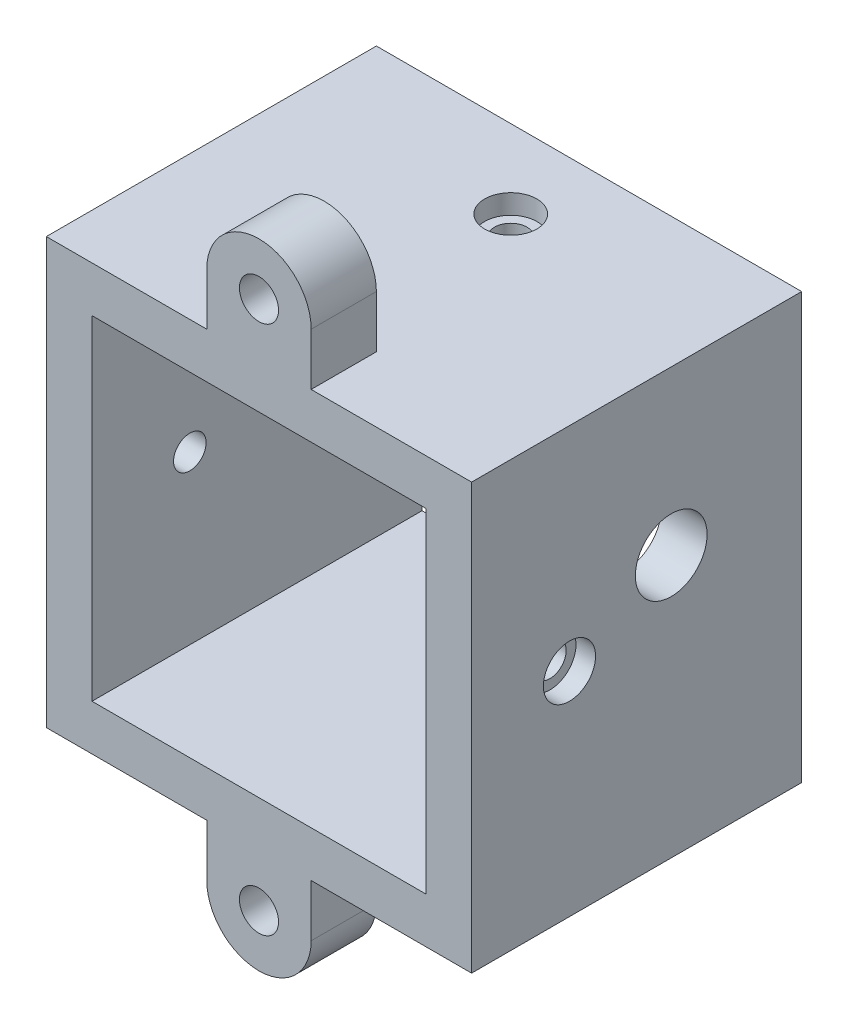
ISO-10303-21;
HEADER;
FILE_DESCRIPTION(('STEP AP214'),'2;1');
FILE_NAME('part.step','',(''),(''),'','','');
FILE_SCHEMA(('AUTOMOTIVE_DESIGN { 1 0 10303 214 1 1 1 1 }'));
ENDSEC;
DATA;
#1=APPLICATION_CONTEXT('core data for automotive mechanical design processes');
#2=APPLICATION_PROTOCOL_DEFINITION('international standard','automotive_design',2000,#1);
#3=PRODUCT_CONTEXT('',#1,'mechanical');
#4=PRODUCT('Part','Part','',(#3));
#5=PRODUCT_RELATED_PRODUCT_CATEGORY('part','',(#4));
#6=PRODUCT_DEFINITION_FORMATION('','',#4);
#7=PRODUCT_DEFINITION_CONTEXT('part definition',#1,'design');
#8=PRODUCT_DEFINITION('design','',#6,#7);
#9=PRODUCT_DEFINITION_SHAPE('','',#8);
#10=(LENGTH_UNIT() NAMED_UNIT(*) SI_UNIT(.MILLI.,.METRE.));
#11=(NAMED_UNIT(*) PLANE_ANGLE_UNIT() SI_UNIT($,.RADIAN.));
#12=(NAMED_UNIT(*) SI_UNIT($,.STERADIAN.) SOLID_ANGLE_UNIT());
#13=UNCERTAINTY_MEASURE_WITH_UNIT(LENGTH_MEASURE(1.E-05),#10,'distance_accuracy_value','');
#14=(GEOMETRIC_REPRESENTATION_CONTEXT(3) GLOBAL_UNCERTAINTY_ASSIGNED_CONTEXT((#13)) GLOBAL_UNIT_ASSIGNED_CONTEXT((#10,
#11,#12)) REPRESENTATION_CONTEXT('',''));
#15=CARTESIAN_POINT('',(0.,0.,0.));
#16=DIRECTION('',(0.,0.,1.));
#17=DIRECTION('',(1.,0.,0.));
#18=AXIS2_PLACEMENT_3D('',#15,#16,#17);
#19=CARTESIAN_POINT('',(0.,18.5289321881345,-38.6));
#20=DIRECTION('',(0.,1.,0.));
#21=DIRECTION('',(0.,0.,1.));
#22=AXIS2_PLACEMENT_3D('',#19,#20,#21);
#23=CYLINDRICAL_SURFACE('',#22,2.5);
#24=CARTESIAN_POINT('',(0.,25.6,-38.6));
#25=DIRECTION('',(0.,-1.,0.));
#26=DIRECTION('',(0.,0.,-1.));
#27=AXIS2_PLACEMENT_3D('',#24,#25,#26);
#28=CIRCLE('',#27,2.5);
#29=CARTESIAN_POINT('',(0.,25.6,-36.1));
#30=VERTEX_POINT('',#29);
#31=EDGE_CURVE('E337',#30,#30,#28,.F.);
#32=CARTESIAN_POINT('',(0.,29.6,-38.6));
#33=DIRECTION('',(0.,1.,0.));
#34=DIRECTION('',(0.,0.,1.));
#35=AXIS2_PLACEMENT_3D('',#32,#33,#34);
#36=CIRCLE('',#35,2.5);
#37=CARTESIAN_POINT('',(0.,29.6,-36.1));
#38=VERTEX_POINT('',#37);
#39=EDGE_CURVE('E62',#38,#38,#36,.F.);
#40=CARTESIAN_POINT('',(0.,25.6,-36.1));
#41=CARTESIAN_POINT('',(0.,25.6416666666667,-36.1));
#42=CARTESIAN_POINT('',(0.,25.6833333333333,-36.1));
#43=CARTESIAN_POINT('',(0.,25.7666666666667,-36.1));
#44=CARTESIAN_POINT('',(0.,25.8083333333333,-36.1));
#45=CARTESIAN_POINT('',(0.,25.8916666666667,-36.1));
#46=CARTESIAN_POINT('',(0.,25.9333333333333,-36.1));
#47=CARTESIAN_POINT('',(0.,26.0166666666667,-36.1));
#48=CARTESIAN_POINT('',(0.,26.0583333333333,-36.1));
#49=CARTESIAN_POINT('',(0.,26.1416666666667,-36.1));
#50=CARTESIAN_POINT('',(0.,26.1833333333333,-36.1));
#51=CARTESIAN_POINT('',(0.,26.2666666666667,-36.1));
#52=CARTESIAN_POINT('',(0.,26.3083333333333,-36.1));
#53=CARTESIAN_POINT('',(0.,26.3916666666667,-36.1));
#54=CARTESIAN_POINT('',(0.,26.4333333333333,-36.1));
#55=CARTESIAN_POINT('',(0.,26.5166666666667,-36.1));
#56=CARTESIAN_POINT('',(0.,26.5583333333333,-36.1));
#57=CARTESIAN_POINT('',(0.,26.6416666666667,-36.1));
#58=CARTESIAN_POINT('',(0.,26.6833333333333,-36.1));
#59=CARTESIAN_POINT('',(0.,26.7666666666667,-36.1));
#60=CARTESIAN_POINT('',(0.,26.8083333333333,-36.1));
#61=CARTESIAN_POINT('',(0.,26.8916666666667,-36.1));
#62=CARTESIAN_POINT('',(0.,26.9333333333333,-36.1));
#63=CARTESIAN_POINT('',(0.,27.0166666666667,-36.1));
#64=CARTESIAN_POINT('',(0.,27.0583333333333,-36.1));
#65=CARTESIAN_POINT('',(0.,27.1416666666667,-36.1));
#66=CARTESIAN_POINT('',(0.,27.1833333333333,-36.1));
#67=CARTESIAN_POINT('',(0.,27.2666666666667,-36.1));
#68=CARTESIAN_POINT('',(0.,27.3083333333333,-36.1));
#69=CARTESIAN_POINT('',(0.,27.3916666666667,-36.1));
#70=CARTESIAN_POINT('',(0.,27.4333333333333,-36.1));
#71=CARTESIAN_POINT('',(0.,27.5166666666667,-36.1));
#72=CARTESIAN_POINT('',(0.,27.5583333333333,-36.1));
#73=CARTESIAN_POINT('',(0.,27.6416666666667,-36.1));
#74=CARTESIAN_POINT('',(0.,27.6833333333333,-36.1));
#75=CARTESIAN_POINT('',(0.,27.7666666666667,-36.1));
#76=CARTESIAN_POINT('',(0.,27.8083333333333,-36.1));
#77=CARTESIAN_POINT('',(0.,27.8916666666667,-36.1));
#78=CARTESIAN_POINT('',(0.,27.9333333333333,-36.1));
#79=CARTESIAN_POINT('',(0.,28.0166666666667,-36.1));
#80=CARTESIAN_POINT('',(0.,28.0583333333333,-36.1));
#81=CARTESIAN_POINT('',(0.,28.1416666666667,-36.1));
#82=CARTESIAN_POINT('',(0.,28.1833333333333,-36.1));
#83=CARTESIAN_POINT('',(0.,28.2666666666667,-36.1));
#84=CARTESIAN_POINT('',(0.,28.3083333333333,-36.1));
#85=CARTESIAN_POINT('',(0.,28.3916666666667,-36.1));
#86=CARTESIAN_POINT('',(0.,28.4333333333333,-36.1));
#87=CARTESIAN_POINT('',(0.,28.5166666666667,-36.1));
#88=CARTESIAN_POINT('',(0.,28.5583333333333,-36.1));
#89=CARTESIAN_POINT('',(0.,28.6416666666667,-36.1));
#90=CARTESIAN_POINT('',(0.,28.6833333333333,-36.1));
#91=CARTESIAN_POINT('',(0.,28.7666666666667,-36.1));
#92=CARTESIAN_POINT('',(0.,28.8083333333333,-36.1));
#93=CARTESIAN_POINT('',(0.,28.8916666666667,-36.1));
#94=CARTESIAN_POINT('',(0.,28.9333333333333,-36.1));
#95=CARTESIAN_POINT('',(0.,29.0166666666667,-36.1));
#96=CARTESIAN_POINT('',(0.,29.0583333333333,-36.1));
#97=CARTESIAN_POINT('',(0.,29.1416666666667,-36.1));
#98=CARTESIAN_POINT('',(0.,29.1833333333333,-36.1));
#99=CARTESIAN_POINT('',(0.,29.2666666666667,-36.1));
#100=CARTESIAN_POINT('',(0.,29.3083333333333,-36.1));
#101=CARTESIAN_POINT('',(0.,29.3916666666667,-36.1));
#102=CARTESIAN_POINT('',(0.,29.4333333333333,-36.1));
#103=CARTESIAN_POINT('',(0.,29.5166666666667,-36.1));
#104=CARTESIAN_POINT('',(0.,29.5583333333333,-36.1));
#105=CARTESIAN_POINT('',(0.,29.6,-36.1));
#106=B_SPLINE_CURVE_WITH_KNOTS('',3,(#40,#41,#42,#43,#44,#45,#46,#47,#48,#49,#50,#51,#52,#53,
#54,#55,#56,#57,#58,#59,#60,#61,#62,#63,#64,#65,#66,#67,#68,#69,#70,#71,#72,#73,#74,#75,#76,#77,
#78,#79,#80,#81,#82,#83,#84,#85,#86,#87,#88,#89,#90,#91,#92,#93,#94,#95,#96,#97,#98,#99,#100,
#101,#102,#103,#104,#105),.UNSPECIFIED.,.F.,.F.,(4,2,2,2,2,2,2,2,2,2,2,2,2,2,2,2,2,2,2,2,2,2,2,
2,2,2,2,2,2,2,2,2,4),(0.,0.125,0.25,0.375,0.5,0.625000000000001,0.750000000000001,
0.875000000000001,1.,1.125,1.25,1.375,1.5,1.625,1.75,1.875,2.,2.125,2.25,2.375,2.5,2.625,2.75,
2.875,3.,3.125,3.25,3.375,3.5,3.625,3.75,3.875,4.),.UNSPECIFIED.);
#107=EDGE_CURVE('BSEAM58',#30,#38,#106,.T.);
#108=ORIENTED_EDGE('',*,*,#31,.F.);
#109=ORIENTED_EDGE('',*,*,#39,.F.);
#110=ORIENTED_EDGE('',*,*,#107,.T.);
#111=ORIENTED_EDGE('',*,*,#107,.F.);
#112=EDGE_LOOP('',(#108,#110,#109,#111));
#113=FACE_BOUND('',#112,.T.);
#114=ADVANCED_FACE('F58',(#113),#23,.F.);
#115=CARTESIAN_POINT('',(-32.6,0.,-15.));
#116=DIRECTION('',(1.,0.,0.));
#117=DIRECTION('',(0.,0.,-1.));
#118=AXIS2_PLACEMENT_3D('',#115,#116,#117);
#119=CYLINDRICAL_SURFACE('',#118,2.5);
#120=CARTESIAN_POINT('',(-25.6,0.,-15.));
#121=DIRECTION('',(1.,0.,0.));
#122=DIRECTION('',(0.,0.,-1.));
#123=AXIS2_PLACEMENT_3D('',#120,#121,#122);
#124=CIRCLE('',#123,2.5);
#125=CARTESIAN_POINT('',(-25.6,0.,-17.5));
#126=VERTEX_POINT('',#125);
#127=EDGE_CURVE('E319',#126,#126,#124,.T.);
#128=ORIENTED_EDGE('',*,*,#127,.T.);
#129=EDGE_LOOP('',(#128));
#130=FACE_BOUND('',#129,.T.);
#131=CARTESIAN_POINT('',(-29.6,0.,-15.));
#132=DIRECTION('',(-1.,0.,0.));
#133=DIRECTION('',(0.,0.,1.));
#134=AXIS2_PLACEMENT_3D('',#131,#132,#133);
#135=CIRCLE('',#134,2.5);
#136=CARTESIAN_POINT('',(-29.6,0.,-12.5));
#137=VERTEX_POINT('',#136);
#138=EDGE_CURVE('E323',#137,#137,#135,.F.);
#139=ORIENTED_EDGE('',*,*,#138,.F.);
#140=EDGE_LOOP('',(#139));
#141=FACE_BOUND('',#140,.T.);
#142=ADVANCED_FACE('F388',(#130,#141),#119,.F.);
#143=CARTESIAN_POINT('',(25.6,0.,-15.));
#144=DIRECTION('',(1.,0.,0.));
#145=DIRECTION('',(0.,0.,-1.));
#146=AXIS2_PLACEMENT_3D('',#143,#144,#145);
#147=CIRCLE('',#146,2.5);
#148=CARTESIAN_POINT('',(25.6,0.,-17.5));
#149=VERTEX_POINT('',#148);
#150=EDGE_CURVE('E316',#149,#149,#147,.T.);
#151=ORIENTED_EDGE('',*,*,#150,.F.);
#152=EDGE_LOOP('',(#151));
#153=FACE_BOUND('',#152,.T.);
#154=CARTESIAN_POINT('',(29.6,0.,-15.));
#155=DIRECTION('',(1.,0.,0.));
#156=DIRECTION('',(0.,0.,-1.));
#157=AXIS2_PLACEMENT_3D('',#154,#155,#156);
#158=CIRCLE('',#157,2.5);
#159=CARTESIAN_POINT('',(29.6,0.,-17.5));
#160=VERTEX_POINT('',#159);
#161=EDGE_CURVE('E320',#160,#160,#158,.F.);
#162=ORIENTED_EDGE('',*,*,#161,.F.);
#163=EDGE_LOOP('',(#162));
#164=FACE_BOUND('',#163,.T.);
#165=ADVANCED_FACE('F394',(#153,#164),#119,.F.);
#166=CARTESIAN_POINT('',(0.,32.6,-50.6));
#167=DIRECTION('',(0.,-1.,0.));
#168=DIRECTION('',(0.,0.,-1.));
#169=AXIS2_PLACEMENT_3D('',#166,#167,#168);
#170=PLANE('',#169);
#171=CARTESIAN_POINT('',(0.,32.6,-38.6));
#172=DIRECTION('',(0.,1.,0.));
#173=DIRECTION('',(0.,0.,1.));
#174=AXIS2_PLACEMENT_3D('',#171,#172,#173);
#175=CIRCLE('',#174,4.);
#176=CARTESIAN_POINT('',(0.,32.6,-34.6));
#177=VERTEX_POINT('',#176);
#178=EDGE_CURVE('E517',#177,#177,#175,.T.);
#179=ORIENTED_EDGE('',*,*,#178,.F.);
#180=EDGE_LOOP('',(#179));
#181=FACE_BOUND('',#180,.T.);
#182=DIRECTION('',(0.,0.,1.));
#183=VECTOR('',#182,1.);
#184=CARTESIAN_POINT('',(-7.99999999999999,32.6,-10.));
#185=LINE('',#184,#183);
#186=CARTESIAN_POINT('',(-7.99999999999999,32.6,-10.));
#187=VERTEX_POINT('',#186);
#188=CARTESIAN_POINT('',(-7.99999999999999,32.6,0.));
#189=VERTEX_POINT('',#188);
#190=EDGE_CURVE('E248',#187,#189,#185,.T.);
#191=ORIENTED_EDGE('',*,*,#190,.F.);
#192=DIRECTION('',(1.,0.,0.));
#193=VECTOR('',#192,1.);
#194=CARTESIAN_POINT('',(0.,32.6,-10.));
#195=LINE('',#194,#193);
#196=CARTESIAN_POINT('',(8.,32.6,-10.));
#197=VERTEX_POINT('',#196);
#198=EDGE_CURVE('E233',#187,#197,#195,.T.);
#199=ORIENTED_EDGE('',*,*,#198,.T.);
#200=DIRECTION('',(0.,0.,1.));
#201=VECTOR('',#200,1.);
#202=CARTESIAN_POINT('',(8.,32.6,-10.));
#203=LINE('',#202,#201);
#204=CARTESIAN_POINT('',(8.,32.6,0.));
#205=VERTEX_POINT('',#204);
#206=EDGE_CURVE('E245',#197,#205,#203,.T.);
#207=ORIENTED_EDGE('',*,*,#206,.T.);
#208=DIRECTION('',(1.,0.,0.));
#209=VECTOR('',#208,1.);
#210=CARTESIAN_POINT('',(0.,32.6,0.));
#211=LINE('',#210,#209);
#212=CARTESIAN_POINT('',(32.6,32.6,0.));
#213=VERTEX_POINT('',#212);
#214=EDGE_CURVE('E307',#205,#213,#211,.T.);
#215=ORIENTED_EDGE('',*,*,#214,.T.);
#216=DIRECTION('',(0.,0.,1.));
#217=VECTOR('',#216,1.);
#218=CARTESIAN_POINT('',(32.6,32.6,-50.6));
#219=LINE('',#218,#217);
#220=CARTESIAN_POINT('',(32.6,32.6,-50.6));
#221=VERTEX_POINT('',#220);
#222=EDGE_CURVE('E67',#221,#213,#219,.T.);
#223=ORIENTED_EDGE('',*,*,#222,.F.);
#224=DIRECTION('',(1.,0.,0.));
#225=VECTOR('',#224,1.);
#226=CARTESIAN_POINT('',(0.,32.6,-50.6));
#227=LINE('',#226,#225);
#228=CARTESIAN_POINT('',(-32.6,32.6,-50.6));
#229=VERTEX_POINT('',#228);
#230=EDGE_CURVE('E295',#229,#221,#227,.T.);
#231=ORIENTED_EDGE('',*,*,#230,.F.);
#232=DIRECTION('',(0.,0.,1.));
#233=VECTOR('',#232,1.);
#234=CARTESIAN_POINT('',(-32.6,32.6,-50.6));
#235=LINE('',#234,#233);
#236=CARTESIAN_POINT('',(-32.6,32.6,0.));
#237=VERTEX_POINT('',#236);
#238=EDGE_CURVE('E12',#229,#237,#235,.T.);
#239=ORIENTED_EDGE('',*,*,#238,.T.);
#240=EDGE_CURVE('E289',#237,#189,#211,.T.);
#241=ORIENTED_EDGE('',*,*,#240,.T.);
#242=EDGE_LOOP('',(#191,#199,#207,#215,#223,#231,#239,#241));
#243=FACE_BOUND('',#242,.T.);
#244=ADVANCED_FACE('F464',(#181,#243),#170,.F.);
#245=CARTESIAN_POINT('',(0.,0.,-50.6));
#246=DIRECTION('',(0.,0.,1.));
#247=DIRECTION('',(1.,0.,0.));
#248=AXIS2_PLACEMENT_3D('',#245,#246,#247);
#249=PLANE('',#248);
#250=DIRECTION('',(0.,1.,0.));
#251=VECTOR('',#250,1.);
#252=CARTESIAN_POINT('',(-32.6,0.,-50.6));
#253=LINE('',#252,#251);
#254=CARTESIAN_POINT('',(-32.6,-32.6,-50.6));
#255=VERTEX_POINT('',#254);
#256=EDGE_CURVE('E285',#255,#229,#253,.T.);
#257=ORIENTED_EDGE('',*,*,#256,.T.);
#258=ORIENTED_EDGE('',*,*,#230,.T.);
#259=DIRECTION('',(0.,1.,0.));
#260=VECTOR('',#259,1.);
#261=CARTESIAN_POINT('',(32.6,0.,-50.6));
#262=LINE('',#261,#260);
#263=CARTESIAN_POINT('',(32.6,-32.6,-50.6));
#264=VERTEX_POINT('',#263);
#265=EDGE_CURVE('E292',#264,#221,#262,.T.);
#266=ORIENTED_EDGE('',*,*,#265,.F.);
#267=DIRECTION('',(1.,0.,0.));
#268=VECTOR('',#267,1.);
#269=CARTESIAN_POINT('',(0.,-32.6,-50.6));
#270=LINE('',#269,#268);
#271=EDGE_CURVE('E288',#255,#264,#270,.T.);
#272=ORIENTED_EDGE('',*,*,#271,.F.);
#273=EDGE_LOOP('',(#257,#258,#266,#272));
#274=FACE_BOUND('',#273,.T.);
#275=DIRECTION('',(0.,1.,0.));
#276=VECTOR('',#275,1.);
#277=CARTESIAN_POINT('',(-25.6,-25.6,-50.6));
#278=LINE('',#277,#276);
#279=CARTESIAN_POINT('',(-25.6,-25.6,-50.6));
#280=VERTEX_POINT('',#279);
#281=CARTESIAN_POINT('',(-25.6,25.6,-50.6));
#282=VERTEX_POINT('',#281);
#283=EDGE_CURVE('E253',#280,#282,#278,.T.);
#284=ORIENTED_EDGE('',*,*,#283,.F.);
#285=DIRECTION('',(1.,0.,0.));
#286=VECTOR('',#285,1.);
#287=CARTESIAN_POINT('',(-25.6,-25.6,-50.6));
#288=LINE('',#287,#286);
#289=CARTESIAN_POINT('',(25.6,-25.6,-50.6));
#290=VERTEX_POINT('',#289);
#291=EDGE_CURVE('E261',#280,#290,#288,.T.);
#292=ORIENTED_EDGE('',*,*,#291,.T.);
#293=DIRECTION('',(0.,1.,0.));
#294=VECTOR('',#293,1.);
#295=CARTESIAN_POINT('',(25.6,-25.6,-50.6));
#296=LINE('',#295,#294);
#297=CARTESIAN_POINT('',(25.6,25.6,-50.6));
#298=VERTEX_POINT('',#297);
#299=EDGE_CURVE('E258',#290,#298,#296,.T.);
#300=ORIENTED_EDGE('',*,*,#299,.T.);
#301=DIRECTION('',(1.,0.,0.));
#302=VECTOR('',#301,1.);
#303=CARTESIAN_POINT('',(-25.6,25.6,-50.6));
#304=LINE('',#303,#302);
#305=EDGE_CURVE('E255',#282,#298,#304,.T.);
#306=ORIENTED_EDGE('',*,*,#305,.F.);
#307=EDGE_LOOP('',(#284,#292,#300,#306));
#308=FACE_BOUND('',#307,.T.);
#309=ADVANCED_FACE('F376',(#274,#308),#249,.F.);
#310=CARTESIAN_POINT('',(0.,0.,0.));
#311=DIRECTION('',(0.,0.,1.));
#312=DIRECTION('',(1.,0.,0.));
#313=AXIS2_PLACEMENT_3D('',#310,#311,#312);
#314=PLANE('',#313);
#315=DIRECTION('',(0.,1.,0.));
#316=VECTOR('',#315,1.);
#317=CARTESIAN_POINT('',(-32.6,0.,0.));
#318=LINE('',#317,#316);
#319=CARTESIAN_POINT('',(-32.6,-32.6,0.));
#320=VERTEX_POINT('',#319);
#321=EDGE_CURVE('E284',#320,#237,#318,.T.);
#322=ORIENTED_EDGE('',*,*,#321,.F.);
#323=DIRECTION('',(1.,0.,0.));
#324=VECTOR('',#323,1.);
#325=CARTESIAN_POINT('',(0.,-32.6,0.));
#326=LINE('',#325,#324);
#327=CARTESIAN_POINT('',(-7.99999999999998,-32.6,0.));
#328=VERTEX_POINT('',#327);
#329=EDGE_CURVE('E301',#320,#328,#326,.T.);
#330=ORIENTED_EDGE('',*,*,#329,.T.);
#331=DIRECTION('',(0.,-1.,0.));
#332=VECTOR('',#331,1.);
#333=CARTESIAN_POINT('',(-7.99999999999992,0.,0.));
#334=LINE('',#333,#332);
#335=CARTESIAN_POINT('',(-7.99999999999999,-40.6,0.));
#336=VERTEX_POINT('',#335);
#337=EDGE_CURVE('E75',#328,#336,#334,.T.);
#338=ORIENTED_EDGE('',*,*,#337,.T.);
#339=CARTESIAN_POINT('',(0.,-40.6,0.));
#340=DIRECTION('',(0.,0.,1.));
#341=DIRECTION('',(1.,0.,0.));
#342=AXIS2_PLACEMENT_3D('',#339,#340,#341);
#343=CIRCLE('',#342,8.);
#344=CARTESIAN_POINT('',(8.00000000000001,-40.6,0.));
#345=VERTEX_POINT('',#344);
#346=EDGE_CURVE('E212',#345,#336,#343,.F.);
#347=ORIENTED_EDGE('',*,*,#346,.F.);
#348=DIRECTION('',(0.,-1.,0.));
#349=VECTOR('',#348,1.);
#350=CARTESIAN_POINT('',(7.99999999999994,0.,0.));
#351=LINE('',#350,#349);
#352=CARTESIAN_POINT('',(7.99999999999999,-32.6,0.));
#353=VERTEX_POINT('',#352);
#354=EDGE_CURVE('E189',#353,#345,#351,.T.);
#355=ORIENTED_EDGE('',*,*,#354,.F.);
#356=CARTESIAN_POINT('',(32.6,-32.6,0.));
#357=VERTEX_POINT('',#356);
#358=EDGE_CURVE('E300',#353,#357,#326,.T.);
#359=ORIENTED_EDGE('',*,*,#358,.T.);
#360=DIRECTION('',(0.,1.,0.));
#361=VECTOR('',#360,1.);
#362=CARTESIAN_POINT('',(32.6,0.,0.));
#363=LINE('',#362,#361);
#364=EDGE_CURVE('E304',#357,#213,#363,.T.);
#365=ORIENTED_EDGE('',*,*,#364,.T.);
#366=ORIENTED_EDGE('',*,*,#214,.F.);
#367=DIRECTION('',(0.,1.,0.));
#368=VECTOR('',#367,1.);
#369=CARTESIAN_POINT('',(7.99999999999994,0.,0.));
#370=LINE('',#369,#368);
#371=CARTESIAN_POINT('',(8.00000000000001,40.6,0.));
#372=VERTEX_POINT('',#371);
#373=EDGE_CURVE('E83',#205,#372,#370,.T.);
#374=ORIENTED_EDGE('',*,*,#373,.T.);
#375=CARTESIAN_POINT('',(0.,40.6,0.));
#376=DIRECTION('',(0.,0.,1.));
#377=DIRECTION('',(1.,0.,0.));
#378=AXIS2_PLACEMENT_3D('',#375,#376,#377);
#379=CIRCLE('',#378,8.);
#380=CARTESIAN_POINT('',(-7.99999999999999,40.6,0.));
#381=VERTEX_POINT('',#380);
#382=EDGE_CURVE('E240',#372,#381,#379,.T.);
#383=ORIENTED_EDGE('',*,*,#382,.T.);
#384=DIRECTION('',(0.,1.,0.));
#385=VECTOR('',#384,1.);
#386=CARTESIAN_POINT('',(-7.99999999999999,0.,0.));
#387=LINE('',#386,#385);
#388=EDGE_CURVE('E225',#189,#381,#387,.T.);
#389=ORIENTED_EDGE('',*,*,#388,.F.);
#390=ORIENTED_EDGE('',*,*,#240,.F.);
#391=EDGE_LOOP('',(#322,#330,#338,#347,#355,#359,#365,#366,#374,#383,#389,#390));
#392=FACE_BOUND('',#391,.T.);
#393=DIRECTION('',(1.,0.,0.));
#394=VECTOR('',#393,1.);
#395=CARTESIAN_POINT('',(-25.6,-25.6,0.));
#396=LINE('',#395,#394);
#397=CARTESIAN_POINT('',(-25.6,-25.6,0.));
#398=VERTEX_POINT('',#397);
#399=CARTESIAN_POINT('',(25.6,-25.6,0.));
#400=VERTEX_POINT('',#399);
#401=EDGE_CURVE('E256',#398,#400,#396,.T.);
#402=ORIENTED_EDGE('',*,*,#401,.F.);
#403=DIRECTION('',(0.,1.,0.));
#404=VECTOR('',#403,1.);
#405=CARTESIAN_POINT('',(-25.6,-25.6,0.));
#406=LINE('',#405,#404);
#407=CARTESIAN_POINT('',(-25.6,25.6,0.));
#408=VERTEX_POINT('',#407);
#409=EDGE_CURVE('E247',#398,#408,#406,.T.);
#410=ORIENTED_EDGE('',*,*,#409,.T.);
#411=DIRECTION('',(1.,0.,0.));
#412=VECTOR('',#411,1.);
#413=CARTESIAN_POINT('',(-25.6,25.6,0.));
#414=LINE('',#413,#412);
#415=CARTESIAN_POINT('',(25.6,25.6,0.));
#416=VERTEX_POINT('',#415);
#417=EDGE_CURVE('E267',#408,#416,#414,.T.);
#418=ORIENTED_EDGE('',*,*,#417,.T.);
#419=DIRECTION('',(0.,1.,0.));
#420=VECTOR('',#419,1.);
#421=CARTESIAN_POINT('',(25.6,-25.6,0.));
#422=LINE('',#421,#420);
#423=EDGE_CURVE('E270',#400,#416,#422,.T.);
#424=ORIENTED_EDGE('',*,*,#423,.F.);
#425=EDGE_LOOP('',(#402,#410,#418,#424));
#426=FACE_BOUND('',#425,.T.);
#427=CARTESIAN_POINT('',(0.,40.6,0.));
#428=DIRECTION('',(0.,0.,1.));
#429=DIRECTION('',(1.,0.,0.));
#430=AXIS2_PLACEMENT_3D('',#427,#428,#429);
#431=CIRCLE('',#430,3.00000000000001);
#432=CARTESIAN_POINT('',(3.00000000000001,40.6,0.));
#433=VERTEX_POINT('',#432);
#434=EDGE_CURVE('E217',#433,#433,#431,.T.);
#435=ORIENTED_EDGE('',*,*,#434,.F.);
#436=EDGE_LOOP('',(#435));
#437=FACE_BOUND('',#436,.T.);
#438=CARTESIAN_POINT('',(0.,-40.6,0.));
#439=DIRECTION('',(0.,0.,1.));
#440=DIRECTION('',(1.,0.,0.));
#441=AXIS2_PLACEMENT_3D('',#438,#439,#440);
#442=CIRCLE('',#441,3.00000000000001);
#443=CARTESIAN_POINT('',(3.00000000000001,-40.6,0.));
#444=VERTEX_POINT('',#443);
#445=EDGE_CURVE('E199',#444,#444,#442,.F.);
#446=ORIENTED_EDGE('',*,*,#445,.T.);
#447=EDGE_LOOP('',(#446));
#448=FACE_BOUND('',#447,.T.);
#449=ADVANCED_FACE('F366',(#392,#426,#437,#448),#314,.T.);
#450=CARTESIAN_POINT('',(-32.6,0.,-50.6));
#451=DIRECTION('',(1.,0.,0.));
#452=DIRECTION('',(0.,0.,-1.));
#453=AXIS2_PLACEMENT_3D('',#450,#451,#452);
#454=PLANE('',#453);
#455=CARTESIAN_POINT('',(-32.6,0.,-15.));
#456=DIRECTION('',(1.,0.,0.));
#457=DIRECTION('',(0.,0.,-1.));
#458=AXIS2_PLACEMENT_3D('',#455,#456,#457);
#459=CIRCLE('',#458,4.);
#460=CARTESIAN_POINT('',(-32.6,0.,-19.));
#461=VERTEX_POINT('',#460);
#462=EDGE_CURVE('E332',#461,#461,#459,.T.);
#463=ORIENTED_EDGE('',*,*,#462,.T.);
#464=EDGE_LOOP('',(#463));
#465=FACE_BOUND('',#464,.T.);
#466=ORIENTED_EDGE('',*,*,#321,.T.);
#467=ORIENTED_EDGE('',*,*,#238,.F.);
#468=ORIENTED_EDGE('',*,*,#256,.F.);
#469=DIRECTION('',(0.,0.,1.));
#470=VECTOR('',#469,1.);
#471=CARTESIAN_POINT('',(-32.6,-32.6,-50.6));
#472=LINE('',#471,#470);
#473=EDGE_CURVE('E297',#255,#320,#472,.T.);
#474=ORIENTED_EDGE('',*,*,#473,.T.);
#475=EDGE_LOOP('',(#466,#467,#468,#474));
#476=FACE_BOUND('',#475,.T.);
#477=ADVANCED_FACE('F60',(#465,#476),#454,.F.);
#478=CARTESIAN_POINT('',(32.6,0.,-50.6));
#479=DIRECTION('',(1.,0.,0.));
#480=DIRECTION('',(0.,0.,-1.));
#481=AXIS2_PLACEMENT_3D('',#478,#479,#480);
#482=PLANE('',#481);
#483=CARTESIAN_POINT('',(32.6,0.,-15.));
#484=DIRECTION('',(1.,0.,0.));
#485=DIRECTION('',(0.,0.,-1.));
#486=AXIS2_PLACEMENT_3D('',#483,#484,#485);
#487=CIRCLE('',#486,4.);
#488=CARTESIAN_POINT('',(32.6,0.,-19.));
#489=VERTEX_POINT('',#488);
#490=EDGE_CURVE('E325',#489,#489,#487,.T.);
#491=ORIENTED_EDGE('',*,*,#490,.F.);
#492=EDGE_LOOP('',(#491));
#493=FACE_BOUND('',#492,.T.);
#494=CARTESIAN_POINT('',(32.6,7.6,-30.6));
#495=DIRECTION('',(1.,0.,0.));
#496=DIRECTION('',(0.,0.,-1.));
#497=AXIS2_PLACEMENT_3D('',#494,#495,#496);
#498=CIRCLE('',#497,5.5);
#499=CARTESIAN_POINT('',(32.6,7.6,-36.1));
#500=VERTEX_POINT('',#499);
#501=EDGE_CURVE('E345',#500,#500,#498,.T.);
#502=ORIENTED_EDGE('',*,*,#501,.F.);
#503=EDGE_LOOP('',(#502));
#504=FACE_BOUND('',#503,.T.);
#505=ORIENTED_EDGE('',*,*,#364,.F.);
#506=DIRECTION('',(0.,0.,1.));
#507=VECTOR('',#506,1.);
#508=CARTESIAN_POINT('',(32.6,-32.6,-50.6));
#509=LINE('',#508,#507);
#510=EDGE_CURVE('E312',#264,#357,#509,.T.);
#511=ORIENTED_EDGE('',*,*,#510,.F.);
#512=ORIENTED_EDGE('',*,*,#265,.T.);
#513=ORIENTED_EDGE('',*,*,#222,.T.);
#514=EDGE_LOOP('',(#505,#511,#512,#513));
#515=FACE_BOUND('',#514,.T.);
#516=ADVANCED_FACE('F462',(#493,#504,#515),#482,.T.);
#517=CARTESIAN_POINT('',(0.,-32.6,-50.6));
#518=DIRECTION('',(0.,-1.,0.));
#519=DIRECTION('',(0.,0.,-1.));
#520=AXIS2_PLACEMENT_3D('',#517,#518,#519);
#521=PLANE('',#520);
#522=DIRECTION('',(0.,0.,1.));
#523=VECTOR('',#522,1.);
#524=CARTESIAN_POINT('',(7.99999999999999,-32.6,-10.));
#525=LINE('',#524,#523);
#526=CARTESIAN_POINT('',(7.99999999999999,-32.6,-10.));
#527=VERTEX_POINT('',#526);
#528=EDGE_CURVE('E193',#527,#353,#525,.T.);
#529=ORIENTED_EDGE('',*,*,#528,.F.);
#530=DIRECTION('',(1.,0.,0.));
#531=VECTOR('',#530,1.);
#532=CARTESIAN_POINT('',(0.,-32.6,-10.));
#533=LINE('',#532,#531);
#534=CARTESIAN_POINT('',(-7.99999999999998,-32.6,-10.));
#535=VERTEX_POINT('',#534);
#536=EDGE_CURVE('E181',#535,#527,#533,.T.);
#537=ORIENTED_EDGE('',*,*,#536,.F.);
#538=DIRECTION('',(0.,0.,1.));
#539=VECTOR('',#538,1.);
#540=CARTESIAN_POINT('',(-7.99999999999998,-32.6,-10.));
#541=LINE('',#540,#539);
#542=EDGE_CURVE('E218',#535,#328,#541,.T.);
#543=ORIENTED_EDGE('',*,*,#542,.T.);
#544=ORIENTED_EDGE('',*,*,#329,.F.);
#545=ORIENTED_EDGE('',*,*,#473,.F.);
#546=ORIENTED_EDGE('',*,*,#271,.T.);
#547=ORIENTED_EDGE('',*,*,#510,.T.);
#548=ORIENTED_EDGE('',*,*,#358,.F.);
#549=EDGE_LOOP('',(#529,#537,#543,#544,#545,#546,#547,#548));
#550=FACE_BOUND('',#549,.T.);
#551=ADVANCED_FACE('F474',(#550),#521,.T.);
#552=CARTESIAN_POINT('',(-25.6,-25.6,-50.6));
#553=DIRECTION('',(1.,0.,0.));
#554=DIRECTION('',(0.,0.,-1.));
#555=AXIS2_PLACEMENT_3D('',#552,#553,#554);
#556=PLANE('',#555);
#557=ORIENTED_EDGE('',*,*,#127,.F.);
#558=EDGE_LOOP('',(#557));
#559=FACE_BOUND('',#558,.T.);
#560=ORIENTED_EDGE('',*,*,#409,.F.);
#561=DIRECTION('',(0.,0.,1.));
#562=VECTOR('',#561,1.);
#563=CARTESIAN_POINT('',(-25.6,-25.6,-50.6));
#564=LINE('',#563,#562);
#565=EDGE_CURVE('E264',#280,#398,#564,.T.);
#566=ORIENTED_EDGE('',*,*,#565,.F.);
#567=ORIENTED_EDGE('',*,*,#283,.T.);
#568=DIRECTION('',(0.,0.,1.));
#569=VECTOR('',#568,1.);
#570=CARTESIAN_POINT('',(-25.6,25.6,-50.6));
#571=LINE('',#570,#569);
#572=EDGE_CURVE('E281',#282,#408,#571,.T.);
#573=ORIENTED_EDGE('',*,*,#572,.T.);
#574=EDGE_LOOP('',(#560,#566,#567,#573));
#575=FACE_BOUND('',#574,.T.);
#576=ADVANCED_FACE('F372',(#559,#575),#556,.T.);
#577=CARTESIAN_POINT('',(-25.6,25.6,-50.6));
#578=DIRECTION('',(0.,-1.,0.));
#579=DIRECTION('',(0.,0.,-1.));
#580=AXIS2_PLACEMENT_3D('',#577,#578,#579);
#581=PLANE('',#580);
#582=ORIENTED_EDGE('',*,*,#31,.T.);
#583=EDGE_LOOP('',(#582));
#584=FACE_BOUND('',#583,.T.);
#585=ORIENTED_EDGE('',*,*,#417,.F.);
#586=ORIENTED_EDGE('',*,*,#572,.F.);
#587=ORIENTED_EDGE('',*,*,#305,.T.);
#588=DIRECTION('',(0.,0.,1.));
#589=VECTOR('',#588,1.);
#590=CARTESIAN_POINT('',(25.6,25.6,-50.6));
#591=LINE('',#590,#589);
#592=EDGE_CURVE('E279',#298,#416,#591,.T.);
#593=ORIENTED_EDGE('',*,*,#592,.T.);
#594=EDGE_LOOP('',(#585,#586,#587,#593));
#595=FACE_BOUND('',#594,.T.);
#596=ADVANCED_FACE('F358',(#584,#595),#581,.T.);
#597=CARTESIAN_POINT('',(25.6,-25.6,-50.6));
#598=DIRECTION('',(1.,0.,0.));
#599=DIRECTION('',(0.,0.,-1.));
#600=AXIS2_PLACEMENT_3D('',#597,#598,#599);
#601=PLANE('',#600);
#602=ORIENTED_EDGE('',*,*,#150,.T.);
#603=EDGE_LOOP('',(#602));
#604=FACE_BOUND('',#603,.T.);
#605=CARTESIAN_POINT('',(25.6,7.6,-30.6));
#606=DIRECTION('',(1.,0.,0.));
#607=DIRECTION('',(0.,0.,-1.));
#608=AXIS2_PLACEMENT_3D('',#605,#606,#607);
#609=CIRCLE('',#608,5.5);
#610=CARTESIAN_POINT('',(25.6,7.6,-36.1));
#611=VERTEX_POINT('',#610);
#612=EDGE_CURVE('E204',#611,#611,#609,.F.);
#613=ORIENTED_EDGE('',*,*,#612,.F.);
#614=EDGE_LOOP('',(#613));
#615=FACE_BOUND('',#614,.T.);
#616=ORIENTED_EDGE('',*,*,#423,.T.);
#617=ORIENTED_EDGE('',*,*,#592,.F.);
#618=ORIENTED_EDGE('',*,*,#299,.F.);
#619=DIRECTION('',(0.,0.,1.));
#620=VECTOR('',#619,1.);
#621=CARTESIAN_POINT('',(25.6,-25.6,-50.6));
#622=LINE('',#621,#620);
#623=EDGE_CURVE('E277',#290,#400,#622,.T.);
#624=ORIENTED_EDGE('',*,*,#623,.T.);
#625=EDGE_LOOP('',(#616,#617,#618,#624));
#626=FACE_BOUND('',#625,.T.);
#627=ADVANCED_FACE('F354',(#604,#615,#626),#601,.F.);
#628=CARTESIAN_POINT('',(-25.6,-25.6,-50.6));
#629=DIRECTION('',(0.,-1.,0.));
#630=DIRECTION('',(0.,0.,-1.));
#631=AXIS2_PLACEMENT_3D('',#628,#629,#630);
#632=PLANE('',#631);
#633=ORIENTED_EDGE('',*,*,#401,.T.);
#634=ORIENTED_EDGE('',*,*,#623,.F.);
#635=ORIENTED_EDGE('',*,*,#291,.F.);
#636=ORIENTED_EDGE('',*,*,#565,.T.);
#637=EDGE_LOOP('',(#633,#634,#635,#636));
#638=FACE_BOUND('',#637,.T.);
#639=ADVANCED_FACE('F357',(#638),#632,.F.);
#640=CARTESIAN_POINT('',(7.99999999999994,0.,-10.));
#641=DIRECTION('',(1.,0.,0.));
#642=DIRECTION('',(0.,1.,0.));
#643=AXIS2_PLACEMENT_3D('',#640,#641,#642);
#644=PLANE('',#643);
#645=ORIENTED_EDGE('',*,*,#373,.F.);
#646=ORIENTED_EDGE('',*,*,#206,.F.);
#647=DIRECTION('',(0.,1.,0.));
#648=VECTOR('',#647,1.);
#649=CARTESIAN_POINT('',(7.99999999999994,0.,-10.));
#650=LINE('',#649,#648);
#651=CARTESIAN_POINT('',(8.00000000000001,40.6,-10.));
#652=VERTEX_POINT('',#651);
#653=EDGE_CURVE('E224',#197,#652,#650,.T.);
#654=ORIENTED_EDGE('',*,*,#653,.T.);
#655=DIRECTION('',(0.,0.,1.));
#656=VECTOR('',#655,1.);
#657=CARTESIAN_POINT('',(8.00000000000001,40.6,-10.));
#658=LINE('',#657,#656);
#659=EDGE_CURVE('E236',#652,#372,#658,.T.);
#660=ORIENTED_EDGE('',*,*,#659,.T.);
#661=EDGE_LOOP('',(#645,#646,#654,#660));
#662=FACE_BOUND('',#661,.T.);
#663=ADVANCED_FACE('F379',(#662),#644,.T.);
#664=CARTESIAN_POINT('',(-7.99999999999999,0.,-10.));
#665=DIRECTION('',(1.,0.,0.));
#666=DIRECTION('',(0.,0.,-1.));
#667=AXIS2_PLACEMENT_3D('',#664,#665,#666);
#668=PLANE('',#667);
#669=ORIENTED_EDGE('',*,*,#388,.T.);
#670=DIRECTION('',(0.,0.,1.));
#671=VECTOR('',#670,1.);
#672=CARTESIAN_POINT('',(-7.99999999999999,40.6,-10.));
#673=LINE('',#672,#671);
#674=CARTESIAN_POINT('',(-7.99999999999999,40.6,-10.));
#675=VERTEX_POINT('',#674);
#676=EDGE_CURVE('E250',#675,#381,#673,.T.);
#677=ORIENTED_EDGE('',*,*,#676,.F.);
#678=DIRECTION('',(0.,1.,0.));
#679=VECTOR('',#678,1.);
#680=CARTESIAN_POINT('',(-7.99999999999999,0.,-10.));
#681=LINE('',#680,#679);
#682=EDGE_CURVE('E231',#187,#675,#681,.T.);
#683=ORIENTED_EDGE('',*,*,#682,.F.);
#684=ORIENTED_EDGE('',*,*,#190,.T.);
#685=EDGE_LOOP('',(#669,#677,#683,#684));
#686=FACE_BOUND('',#685,.T.);
#687=ADVANCED_FACE('F384',(#686),#668,.F.);
#688=CARTESIAN_POINT('',(0.,40.6,-10.));
#689=DIRECTION('',(0.,0.,1.));
#690=DIRECTION('',(1.,0.,0.));
#691=AXIS2_PLACEMENT_3D('',#688,#689,#690);
#692=CYLINDRICAL_SURFACE('',#691,3.00000000000001);
#693=CARTESIAN_POINT('',(0.,40.6,-10.));
#694=DIRECTION('',(0.,0.,1.));
#695=DIRECTION('',(1.,0.,0.));
#696=AXIS2_PLACEMENT_3D('',#693,#694,#695);
#697=CIRCLE('',#696,3.00000000000001);
#698=CARTESIAN_POINT('',(3.00000000000001,40.6,-10.));
#699=VERTEX_POINT('',#698);
#700=EDGE_CURVE('E221',#699,#699,#697,.T.);
#701=ORIENTED_EDGE('',*,*,#700,.F.);
#702=EDGE_LOOP('',(#701));
#703=FACE_BOUND('',#702,.T.);
#704=ORIENTED_EDGE('',*,*,#434,.T.);
#705=EDGE_LOOP('',(#704));
#706=FACE_BOUND('',#705,.T.);
#707=ADVANCED_FACE('F441',(#703,#706),#692,.F.);
#708=CARTESIAN_POINT('',(0.,40.6,-10.));
#709=DIRECTION('',(0.,0.,1.));
#710=DIRECTION('',(1.,0.,0.));
#711=AXIS2_PLACEMENT_3D('',#708,#709,#710);
#712=CYLINDRICAL_SURFACE('',#711,8.);
#713=ORIENTED_EDGE('',*,*,#382,.F.);
#714=ORIENTED_EDGE('',*,*,#659,.F.);
#715=CARTESIAN_POINT('',(0.,40.6,-10.));
#716=DIRECTION('',(0.,0.,1.));
#717=DIRECTION('',(1.,0.,0.));
#718=AXIS2_PLACEMENT_3D('',#715,#716,#717);
#719=CIRCLE('',#718,8.);
#720=EDGE_CURVE('E228',#652,#675,#719,.T.);
#721=ORIENTED_EDGE('',*,*,#720,.T.);
#722=ORIENTED_EDGE('',*,*,#676,.T.);
#723=EDGE_LOOP('',(#713,#714,#721,#722));
#724=FACE_BOUND('',#723,.T.);
#725=ADVANCED_FACE('F437',(#724),#712,.T.);
#726=CARTESIAN_POINT('',(0.,0.,-10.));
#727=DIRECTION('',(0.,0.,1.));
#728=DIRECTION('',(1.,0.,0.));
#729=AXIS2_PLACEMENT_3D('',#726,#727,#728);
#730=PLANE('',#729);
#731=ORIENTED_EDGE('',*,*,#700,.T.);
#732=EDGE_LOOP('',(#731));
#733=FACE_BOUND('',#732,.T.);
#734=ORIENTED_EDGE('',*,*,#653,.F.);
#735=ORIENTED_EDGE('',*,*,#198,.F.);
#736=ORIENTED_EDGE('',*,*,#682,.T.);
#737=ORIENTED_EDGE('',*,*,#720,.F.);
#738=EDGE_LOOP('',(#734,#735,#736,#737));
#739=FACE_BOUND('',#738,.T.);
#740=ADVANCED_FACE('F434',(#733,#739),#730,.F.);
#741=CARTESIAN_POINT('',(0.,-40.6,-10.));
#742=DIRECTION('',(0.,0.,1.));
#743=DIRECTION('',(1.,0.,0.));
#744=AXIS2_PLACEMENT_3D('',#741,#742,#743);
#745=CYLINDRICAL_SURFACE('',#744,8.);
#746=ORIENTED_EDGE('',*,*,#346,.T.);
#747=DIRECTION('',(0.,0.,1.));
#748=VECTOR('',#747,1.);
#749=CARTESIAN_POINT('',(-7.99999999999999,-40.6,-10.));
#750=LINE('',#749,#748);
#751=CARTESIAN_POINT('',(-7.99999999999999,-40.6,-10.));
#752=VERTEX_POINT('',#751);
#753=EDGE_CURVE('E197',#752,#336,#750,.T.);
#754=ORIENTED_EDGE('',*,*,#753,.F.);
#755=CARTESIAN_POINT('',(0.,-40.6,-10.));
#756=DIRECTION('',(0.,0.,1.));
#757=DIRECTION('',(1.,0.,0.));
#758=AXIS2_PLACEMENT_3D('',#755,#756,#757);
#759=CIRCLE('',#758,8.);
#760=CARTESIAN_POINT('',(8.00000000000001,-40.6,-10.));
#761=VERTEX_POINT('',#760);
#762=EDGE_CURVE('E178',#761,#752,#759,.F.);
#763=ORIENTED_EDGE('',*,*,#762,.F.);
#764=DIRECTION('',(0.,0.,1.));
#765=VECTOR('',#764,1.);
#766=CARTESIAN_POINT('',(8.00000000000001,-40.6,-10.));
#767=LINE('',#766,#765);
#768=EDGE_CURVE('E186',#761,#345,#767,.T.);
#769=ORIENTED_EDGE('',*,*,#768,.T.);
#770=EDGE_LOOP('',(#746,#754,#763,#769));
#771=FACE_BOUND('',#770,.T.);
#772=ADVANCED_FACE('F196',(#771),#745,.T.);
#773=CARTESIAN_POINT('',(-7.99999999999992,0.,-10.));
#774=DIRECTION('',(-1.,0.,0.));
#775=DIRECTION('',(0.,-1.,0.));
#776=AXIS2_PLACEMENT_3D('',#773,#774,#775);
#777=PLANE('',#776);
#778=ORIENTED_EDGE('',*,*,#337,.F.);
#779=ORIENTED_EDGE('',*,*,#542,.F.);
#780=DIRECTION('',(0.,-1.,0.));
#781=VECTOR('',#780,1.);
#782=CARTESIAN_POINT('',(-7.99999999999992,0.,-10.));
#783=LINE('',#782,#781);
#784=EDGE_CURVE('E208',#535,#752,#783,.T.);
#785=ORIENTED_EDGE('',*,*,#784,.T.);
#786=ORIENTED_EDGE('',*,*,#753,.T.);
#787=EDGE_LOOP('',(#778,#779,#785,#786));
#788=FACE_BOUND('',#787,.T.);
#789=ADVANCED_FACE('F427',(#788),#777,.T.);
#790=CARTESIAN_POINT('',(7.99999999999994,0.,-10.));
#791=DIRECTION('',(-1.,0.,0.));
#792=DIRECTION('',(0.,-1.,0.));
#793=AXIS2_PLACEMENT_3D('',#790,#791,#792);
#794=PLANE('',#793);
#795=ORIENTED_EDGE('',*,*,#354,.T.);
#796=ORIENTED_EDGE('',*,*,#768,.F.);
#797=DIRECTION('',(0.,-1.,0.));
#798=VECTOR('',#797,1.);
#799=CARTESIAN_POINT('',(7.99999999999994,0.,-10.));
#800=LINE('',#799,#798);
#801=EDGE_CURVE('E172',#527,#761,#800,.T.);
#802=ORIENTED_EDGE('',*,*,#801,.F.);
#803=ORIENTED_EDGE('',*,*,#528,.T.);
#804=EDGE_LOOP('',(#795,#796,#802,#803));
#805=FACE_BOUND('',#804,.T.);
#806=ADVANCED_FACE('F187',(#805),#794,.F.);
#807=CARTESIAN_POINT('',(0.,-40.6,-10.));
#808=DIRECTION('',(0.,0.,1.));
#809=DIRECTION('',(1.,0.,0.));
#810=AXIS2_PLACEMENT_3D('',#807,#808,#809);
#811=CYLINDRICAL_SURFACE('',#810,3.00000000000001);
#812=CARTESIAN_POINT('',(0.,-40.6,-10.));
#813=DIRECTION('',(0.,0.,1.));
#814=DIRECTION('',(1.,0.,0.));
#815=AXIS2_PLACEMENT_3D('',#812,#813,#814);
#816=CIRCLE('',#815,3.00000000000001);
#817=CARTESIAN_POINT('',(3.00000000000001,-40.6,-10.));
#818=VERTEX_POINT('',#817);
#819=EDGE_CURVE('E194',#818,#818,#816,.F.);
#820=ORIENTED_EDGE('',*,*,#819,.T.);
#821=EDGE_LOOP('',(#820));
#822=FACE_BOUND('',#821,.T.);
#823=ORIENTED_EDGE('',*,*,#445,.F.);
#824=EDGE_LOOP('',(#823));
#825=FACE_BOUND('',#824,.T.);
#826=ADVANCED_FACE('F423',(#822,#825),#811,.F.);
#827=CARTESIAN_POINT('',(0.,0.,-10.));
#828=DIRECTION('',(0.,0.,1.));
#829=DIRECTION('',(1.,0.,0.));
#830=AXIS2_PLACEMENT_3D('',#827,#828,#829);
#831=PLANE('',#830);
#832=ORIENTED_EDGE('',*,*,#762,.T.);
#833=ORIENTED_EDGE('',*,*,#784,.F.);
#834=ORIENTED_EDGE('',*,*,#536,.T.);
#835=ORIENTED_EDGE('',*,*,#801,.T.);
#836=EDGE_LOOP('',(#832,#833,#834,#835));
#837=FACE_BOUND('',#836,.T.);
#838=ORIENTED_EDGE('',*,*,#819,.F.);
#839=EDGE_LOOP('',(#838));
#840=FACE_BOUND('',#839,.T.);
#841=ADVANCED_FACE('F174',(#837,#840),#831,.F.);
#842=CARTESIAN_POINT('',(10.043650813896,7.6,-30.6));
#843=DIRECTION('',(1.,0.,0.));
#844=DIRECTION('',(0.,0.,-1.));
#845=AXIS2_PLACEMENT_3D('',#842,#843,#844);
#846=CYLINDRICAL_SURFACE('',#845,5.5);
#847=ORIENTED_EDGE('',*,*,#612,.T.);
#848=EDGE_LOOP('',(#847));
#849=FACE_BOUND('',#848,.T.);
#850=ORIENTED_EDGE('',*,*,#501,.T.);
#851=EDGE_LOOP('',(#850));
#852=FACE_BOUND('',#851,.T.);
#853=ADVANCED_FACE('F352',(#849,#852),#846,.F.);
#854=CARTESIAN_POINT('',(29.6,0.,-15.));
#855=DIRECTION('',(1.,0.,0.));
#856=DIRECTION('',(0.,0.,-1.));
#857=AXIS2_PLACEMENT_3D('',#854,#855,#856);
#858=PLANE('',#857);
#859=CARTESIAN_POINT('',(29.6,0.,-15.));
#860=DIRECTION('',(1.,0.,0.));
#861=DIRECTION('',(0.,0.,-1.));
#862=AXIS2_PLACEMENT_3D('',#859,#860,#861);
#863=CIRCLE('',#862,4.);
#864=CARTESIAN_POINT('',(29.6,0.,-19.));
#865=VERTEX_POINT('',#864);
#866=EDGE_CURVE('E322',#865,#865,#863,.T.);
#867=ORIENTED_EDGE('',*,*,#866,.T.);
#868=EDGE_LOOP('',(#867));
#869=FACE_BOUND('',#868,.T.);
#870=ORIENTED_EDGE('',*,*,#161,.T.);
#871=EDGE_LOOP('',(#870));
#872=FACE_BOUND('',#871,.T.);
#873=ADVANCED_FACE('F412',(#869,#872),#858,.T.);
#874=CARTESIAN_POINT('',(29.6,0.,-15.));
#875=DIRECTION('',(1.,0.,0.));
#876=DIRECTION('',(0.,0.,-1.));
#877=AXIS2_PLACEMENT_3D('',#874,#875,#876);
#878=CYLINDRICAL_SURFACE('',#877,4.);
#879=ORIENTED_EDGE('',*,*,#866,.F.);
#880=EDGE_LOOP('',(#879));
#881=FACE_BOUND('',#880,.T.);
#882=ORIENTED_EDGE('',*,*,#490,.T.);
#883=EDGE_LOOP('',(#882));
#884=FACE_BOUND('',#883,.T.);
#885=ADVANCED_FACE('F407',(#881,#884),#878,.F.);
#886=CARTESIAN_POINT('',(-29.6,0.,-15.));
#887=DIRECTION('',(-1.,0.,0.));
#888=DIRECTION('',(0.,0.,-1.));
#889=AXIS2_PLACEMENT_3D('',#886,#887,#888);
#890=PLANE('',#889);
#891=CARTESIAN_POINT('',(-29.6,0.,-15.));
#892=DIRECTION('',(1.,0.,0.));
#893=DIRECTION('',(0.,0.,-1.));
#894=AXIS2_PLACEMENT_3D('',#891,#892,#893);
#895=CIRCLE('',#894,4.);
#896=CARTESIAN_POINT('',(-29.6,0.,-19.));
#897=VERTEX_POINT('',#896);
#898=EDGE_CURVE('E326',#897,#897,#895,.T.);
#899=ORIENTED_EDGE('',*,*,#898,.F.);
#900=EDGE_LOOP('',(#899));
#901=FACE_BOUND('',#900,.T.);
#902=ORIENTED_EDGE('',*,*,#138,.T.);
#903=EDGE_LOOP('',(#902));
#904=FACE_BOUND('',#903,.T.);
#905=ADVANCED_FACE('F403',(#901,#904),#890,.T.);
#906=CARTESIAN_POINT('',(-29.6,0.,-15.));
#907=DIRECTION('',(-1.,0.,0.));
#908=DIRECTION('',(0.,0.,1.));
#909=AXIS2_PLACEMENT_3D('',#906,#907,#908);
#910=CYLINDRICAL_SURFACE('',#909,4.);
#911=ORIENTED_EDGE('',*,*,#898,.T.);
#912=EDGE_LOOP('',(#911));
#913=FACE_BOUND('',#912,.T.);
#914=ORIENTED_EDGE('',*,*,#462,.F.);
#915=EDGE_LOOP('',(#914));
#916=FACE_BOUND('',#915,.T.);
#917=ADVANCED_FACE('F406',(#913,#916),#910,.F.);
#918=CARTESIAN_POINT('',(0.,29.6,-38.6));
#919=DIRECTION('',(0.,1.,0.));
#920=DIRECTION('',(0.,0.,1.));
#921=AXIS2_PLACEMENT_3D('',#918,#919,#920);
#922=PLANE('',#921);
#923=CARTESIAN_POINT('',(0.,29.6,-38.6));
#924=DIRECTION('',(0.,1.,0.));
#925=DIRECTION('',(0.,0.,1.));
#926=AXIS2_PLACEMENT_3D('',#923,#924,#925);
#927=CIRCLE('',#926,4.);
#928=CARTESIAN_POINT('',(0.,29.6,-34.6));
#929=VERTEX_POINT('',#928);
#930=EDGE_CURVE('E513',#929,#929,#927,.T.);
#931=ORIENTED_EDGE('',*,*,#930,.T.);
#932=EDGE_LOOP('',(#931));
#933=FACE_BOUND('',#932,.T.);
#934=ORIENTED_EDGE('',*,*,#39,.T.);
#935=EDGE_LOOP('',(#934));
#936=FACE_BOUND('',#935,.T.);
#937=ADVANCED_FACE('F411',(#933,#936),#922,.T.);
#938=CARTESIAN_POINT('',(0.,29.6,-38.6));
#939=DIRECTION('',(0.,1.,0.));
#940=DIRECTION('',(0.,0.,1.));
#941=AXIS2_PLACEMENT_3D('',#938,#939,#940);
#942=CYLINDRICAL_SURFACE('',#941,4.);
#943=ORIENTED_EDGE('',*,*,#930,.F.);
#944=EDGE_LOOP('',(#943));
#945=FACE_BOUND('',#944,.T.);
#946=ORIENTED_EDGE('',*,*,#178,.T.);
#947=EDGE_LOOP('',(#946));
#948=FACE_BOUND('',#947,.T.);
#949=ADVANCED_FACE('F401',(#945,#948),#942,.F.);
#950=CLOSED_SHELL('',(#114,#142,#165,#244,#309,#449,#477,#516,#551,#576,#596,#627,#639,#663,
#687,#707,#725,#740,#772,#789,#806,#826,#841,#853,#873,#885,#905,#917,#937,#949));
#951=MANIFOLD_SOLID_BREP('B2',#950);
#952=ADVANCED_BREP_SHAPE_REPRESENTATION('',(#18,#951),#14);
#953=SHAPE_DEFINITION_REPRESENTATION(#9,#952);
ENDSEC;
END-ISO-10303-21;
